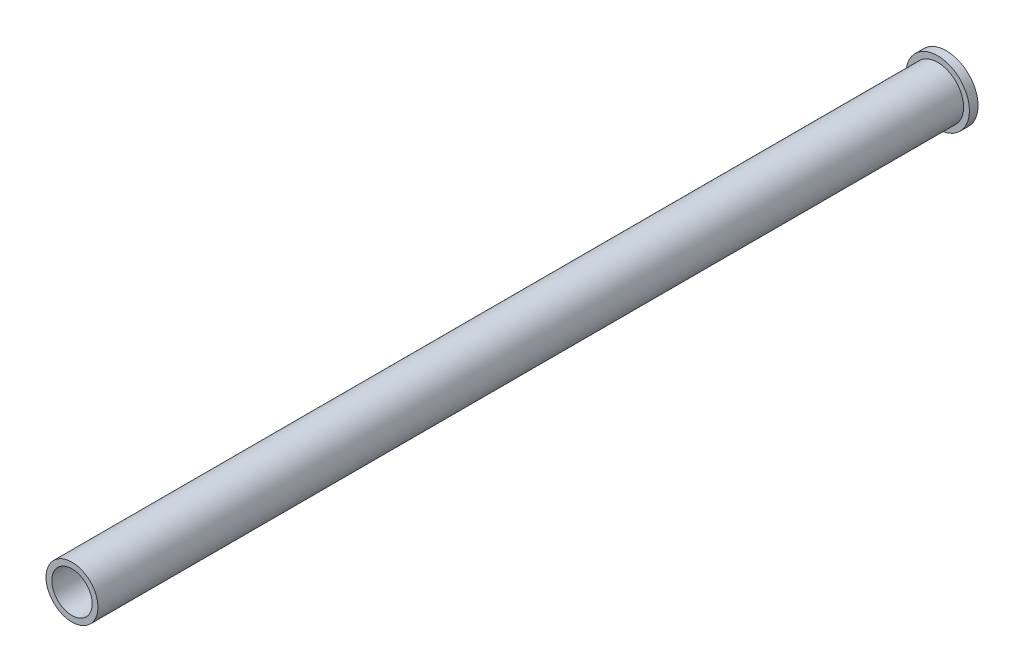
ISO-10303-21;
HEADER;
FILE_DESCRIPTION(('STEP AP214'),'2;1');
FILE_NAME('part.step','',(''),(''),'','','');
FILE_SCHEMA(('AUTOMOTIVE_DESIGN { 1 0 10303 214 1 1 1 1 }'));
ENDSEC;
DATA;
#1=APPLICATION_CONTEXT('core data for automotive mechanical design processes');
#2=APPLICATION_PROTOCOL_DEFINITION('international standard','automotive_design',2000,#1);
#3=PRODUCT_CONTEXT('',#1,'mechanical');
#4=PRODUCT('Part','Part','',(#3));
#5=PRODUCT_RELATED_PRODUCT_CATEGORY('part','',(#4));
#6=PRODUCT_DEFINITION_FORMATION('','',#4);
#7=PRODUCT_DEFINITION_CONTEXT('part definition',#1,'design');
#8=PRODUCT_DEFINITION('design','',#6,#7);
#9=PRODUCT_DEFINITION_SHAPE('','',#8);
#10=(LENGTH_UNIT() NAMED_UNIT(*) SI_UNIT(.MILLI.,.METRE.));
#11=(NAMED_UNIT(*) PLANE_ANGLE_UNIT() SI_UNIT($,.RADIAN.));
#12=(NAMED_UNIT(*) SI_UNIT($,.STERADIAN.) SOLID_ANGLE_UNIT());
#13=UNCERTAINTY_MEASURE_WITH_UNIT(LENGTH_MEASURE(1.E-05),#10,'distance_accuracy_value','');
#14=(GEOMETRIC_REPRESENTATION_CONTEXT(3) GLOBAL_UNCERTAINTY_ASSIGNED_CONTEXT((#13)) GLOBAL_UNIT_ASSIGNED_CONTEXT((#10,
#11,#12)) REPRESENTATION_CONTEXT('',''));
#15=CARTESIAN_POINT('',(0.,0.,0.));
#16=DIRECTION('',(0.,0.,1.));
#17=DIRECTION('',(1.,0.,0.));
#18=AXIS2_PLACEMENT_3D('',#15,#16,#17);
#19=CARTESIAN_POINT('',(-8.45443022772333,1.68372127416524,0.762));
#20=DIRECTION('',(0.,0.,-1.));
#21=DIRECTION('',(-1.,0.,0.));
#22=AXIS2_PLACEMENT_3D('',#19,#20,#21);
#23=CYLINDRICAL_SURFACE('',#22,2.794);
#24=CARTESIAN_POINT('',(-8.45443022772333,1.68372127416524,0.762));
#25=DIRECTION('',(0.,0.,1.));
#26=DIRECTION('',(1.,0.,0.));
#27=AXIS2_PLACEMENT_3D('',#24,#25,#26);
#28=CIRCLE('',#27,2.794);
#29=CARTESIAN_POINT('',(-11.2484302277233,1.68372127416524,0.762));
#30=VERTEX_POINT('',#29);
#31=EDGE_CURVE('E38',#30,#30,#28,.T.);
#32=CARTESIAN_POINT('',(-8.45443022772333,1.68372127416524,0.));
#33=DIRECTION('',(0.,0.,1.));
#34=DIRECTION('',(1.,0.,0.));
#35=AXIS2_PLACEMENT_3D('',#32,#33,#34);
#36=CIRCLE('',#35,2.794);
#37=CARTESIAN_POINT('',(-11.2484302277233,1.68372127416524,0.));
#38=VERTEX_POINT('',#37);
#39=EDGE_CURVE('E34',#38,#38,#36,.T.);
#40=CARTESIAN_POINT('',(-11.2484302277233,1.68372127416524,0.762));
#41=CARTESIAN_POINT('',(-11.2484302277233,1.68372127416524,0.7540625));
#42=CARTESIAN_POINT('',(-11.2484302277233,1.68372127416524,0.746125));
#43=CARTESIAN_POINT('',(-11.2484302277233,1.68372127416524,0.73025));
#44=CARTESIAN_POINT('',(-11.2484302277233,1.68372127416524,0.7223125));
#45=CARTESIAN_POINT('',(-11.2484302277233,1.68372127416524,0.7064375));
#46=CARTESIAN_POINT('',(-11.2484302277233,1.68372127416524,0.6985));
#47=CARTESIAN_POINT('',(-11.2484302277233,1.68372127416524,0.682625));
#48=CARTESIAN_POINT('',(-11.2484302277233,1.68372127416524,0.6746875));
#49=CARTESIAN_POINT('',(-11.2484302277233,1.68372127416524,0.6588125));
#50=CARTESIAN_POINT('',(-11.2484302277233,1.68372127416524,0.650875));
#51=CARTESIAN_POINT('',(-11.2484302277233,1.68372127416524,0.635));
#52=CARTESIAN_POINT('',(-11.2484302277233,1.68372127416524,0.6270625));
#53=CARTESIAN_POINT('',(-11.2484302277233,1.68372127416524,0.6111875));
#54=CARTESIAN_POINT('',(-11.2484302277233,1.68372127416524,0.60325));
#55=CARTESIAN_POINT('',(-11.2484302277233,1.68372127416524,0.587375));
#56=CARTESIAN_POINT('',(-11.2484302277233,1.68372127416524,0.5794375));
#57=CARTESIAN_POINT('',(-11.2484302277233,1.68372127416524,0.5635625));
#58=CARTESIAN_POINT('',(-11.2484302277233,1.68372127416524,0.555625));
#59=CARTESIAN_POINT('',(-11.2484302277233,1.68372127416524,0.53975));
#60=CARTESIAN_POINT('',(-11.2484302277233,1.68372127416524,0.5318125));
#61=CARTESIAN_POINT('',(-11.2484302277233,1.68372127416524,0.5159375));
#62=CARTESIAN_POINT('',(-11.2484302277233,1.68372127416524,0.508));
#63=CARTESIAN_POINT('',(-11.2484302277233,1.68372127416524,0.492125));
#64=CARTESIAN_POINT('',(-11.2484302277233,1.68372127416524,0.4841875));
#65=CARTESIAN_POINT('',(-11.2484302277233,1.68372127416524,0.4683125));
#66=CARTESIAN_POINT('',(-11.2484302277233,1.68372127416524,0.460375));
#67=CARTESIAN_POINT('',(-11.2484302277233,1.68372127416524,0.4445));
#68=CARTESIAN_POINT('',(-11.2484302277233,1.68372127416524,0.4365625));
#69=CARTESIAN_POINT('',(-11.2484302277233,1.68372127416524,0.4206875));
#70=CARTESIAN_POINT('',(-11.2484302277233,1.68372127416524,0.41275));
#71=CARTESIAN_POINT('',(-11.2484302277233,1.68372127416524,0.396875));
#72=CARTESIAN_POINT('',(-11.2484302277233,1.68372127416524,0.3889375));
#73=CARTESIAN_POINT('',(-11.2484302277233,1.68372127416524,0.3730625));
#74=CARTESIAN_POINT('',(-11.2484302277233,1.68372127416524,0.365125));
#75=CARTESIAN_POINT('',(-11.2484302277233,1.68372127416524,0.34925));
#76=CARTESIAN_POINT('',(-11.2484302277233,1.68372127416524,0.3413125));
#77=CARTESIAN_POINT('',(-11.2484302277233,1.68372127416524,0.3254375));
#78=CARTESIAN_POINT('',(-11.2484302277233,1.68372127416524,0.3175));
#79=CARTESIAN_POINT('',(-11.2484302277233,1.68372127416524,0.301625));
#80=CARTESIAN_POINT('',(-11.2484302277233,1.68372127416524,0.2936875));
#81=CARTESIAN_POINT('',(-11.2484302277233,1.68372127416524,0.2778125));
#82=CARTESIAN_POINT('',(-11.2484302277233,1.68372127416524,0.269875));
#83=CARTESIAN_POINT('',(-11.2484302277233,1.68372127416524,0.254));
#84=CARTESIAN_POINT('',(-11.2484302277233,1.68372127416524,0.2460625));
#85=CARTESIAN_POINT('',(-11.2484302277233,1.68372127416524,0.2301875));
#86=CARTESIAN_POINT('',(-11.2484302277233,1.68372127416524,0.22225));
#87=CARTESIAN_POINT('',(-11.2484302277233,1.68372127416524,0.206375));
#88=CARTESIAN_POINT('',(-11.2484302277233,1.68372127416524,0.1984375));
#89=CARTESIAN_POINT('',(-11.2484302277233,1.68372127416524,0.1825625));
#90=CARTESIAN_POINT('',(-11.2484302277233,1.68372127416524,0.174625));
#91=CARTESIAN_POINT('',(-11.2484302277233,1.68372127416524,0.15875));
#92=CARTESIAN_POINT('',(-11.2484302277233,1.68372127416524,0.1508125));
#93=CARTESIAN_POINT('',(-11.2484302277233,1.68372127416524,0.1349375));
#94=CARTESIAN_POINT('',(-11.2484302277233,1.68372127416524,0.127));
#95=CARTESIAN_POINT('',(-11.2484302277233,1.68372127416524,0.111125));
#96=CARTESIAN_POINT('',(-11.2484302277233,1.68372127416524,0.1031875));
#97=CARTESIAN_POINT('',(-11.2484302277233,1.68372127416524,0.0873125));
#98=CARTESIAN_POINT('',(-11.2484302277233,1.68372127416524,0.079375));
#99=CARTESIAN_POINT('',(-11.2484302277233,1.68372127416524,0.0635));
#100=CARTESIAN_POINT('',(-11.2484302277233,1.68372127416524,0.0555625));
#101=CARTESIAN_POINT('',(-11.2484302277233,1.68372127416524,0.0396875));
#102=CARTESIAN_POINT('',(-11.2484302277233,1.68372127416524,0.03175));
#103=CARTESIAN_POINT('',(-11.2484302277233,1.68372127416524,0.015875));
#104=CARTESIAN_POINT('',(-11.2484302277233,1.68372127416524,0.00793749999999999));
#105=CARTESIAN_POINT('',(-11.2484302277233,1.68372127416524,0.));
#106=B_SPLINE_CURVE_WITH_KNOTS('',3,(#40,#41,#42,#43,#44,#45,#46,#47,#48,#49,#50,#51,#52,#53,
#54,#55,#56,#57,#58,#59,#60,#61,#62,#63,#64,#65,#66,#67,#68,#69,#70,#71,#72,#73,#74,#75,#76,#77,
#78,#79,#80,#81,#82,#83,#84,#85,#86,#87,#88,#89,#90,#91,#92,#93,#94,#95,#96,#97,#98,#99,#100,
#101,#102,#103,#104,#105),.UNSPECIFIED.,.F.,.F.,(4,2,2,2,2,2,2,2,2,2,2,2,2,2,2,2,2,2,2,2,2,2,2,
2,2,2,2,2,2,2,2,2,4),(0.,0.0238125,0.0476249999999999,0.0714374999999999,0.09525,0.1190625,
0.142875,0.1666875,0.1905,0.2143125,0.238125,0.2619375,0.28575,0.3095625,0.333375,0.3571875,
0.381,0.4048125,0.428625,0.4524375,0.47625,0.5000625,0.523875,0.5476875,0.5715,0.5953125,
0.619125,0.6429375,0.66675,0.6905625,0.714375,0.7381875,0.762),.UNSPECIFIED.);
#107=EDGE_CURVE('BSEAM31',#30,#38,#106,.T.);
#108=ORIENTED_EDGE('',*,*,#31,.F.);
#109=ORIENTED_EDGE('',*,*,#39,.T.);
#110=ORIENTED_EDGE('',*,*,#107,.T.);
#111=ORIENTED_EDGE('',*,*,#107,.F.);
#112=EDGE_LOOP('',(#108,#110,#109,#111));
#113=FACE_BOUND('',#112,.T.);
#114=ADVANCED_FACE('F31',(#113),#23,.T.);
#115=CARTESIAN_POINT('',(-8.45443022772333,1.68372127416524,0.762));
#116=DIRECTION('',(0.,0.,1.));
#117=DIRECTION('',(1.,0.,0.));
#118=AXIS2_PLACEMENT_3D('',#115,#116,#117);
#119=PLANE('',#118);
#120=CARTESIAN_POINT('',(-8.45443022772333,1.68372127416524,0.762));
#121=DIRECTION('',(0.,0.,1.));
#122=DIRECTION('',(1.,0.,0.));
#123=AXIS2_PLACEMENT_3D('',#120,#121,#122);
#124=CIRCLE('',#123,2.286);
#125=CARTESIAN_POINT('',(-10.7404302277233,1.68372127416524,0.761999999999999));
#126=VERTEX_POINT('',#125);
#127=EDGE_CURVE('E10',#126,#126,#124,.T.);
#128=ORIENTED_EDGE('',*,*,#127,.F.);
#129=EDGE_LOOP('',(#128));
#130=FACE_BOUND('',#129,.T.);
#131=ORIENTED_EDGE('',*,*,#31,.T.);
#132=EDGE_LOOP('',(#131));
#133=FACE_BOUND('',#132,.T.);
#134=ADVANCED_FACE('F75',(#130,#133),#119,.T.);
#135=CARTESIAN_POINT('',(-8.45443022772333,1.68372127416524,0.));
#136=DIRECTION('',(0.,0.,1.));
#137=DIRECTION('',(1.,0.,0.));
#138=AXIS2_PLACEMENT_3D('',#135,#136,#137);
#139=PLANE('',#138);
#140=ORIENTED_EDGE('',*,*,#39,.F.);
#141=EDGE_LOOP('',(#140));
#142=FACE_BOUND('',#141,.T.);
#143=ADVANCED_FACE('F70',(#142),#139,.F.);
#144=CARTESIAN_POINT('',(-8.45443022772333,1.68372127416524,76.962));
#145=DIRECTION('',(0.,0.,-1.));
#146=DIRECTION('',(-1.,0.,0.));
#147=AXIS2_PLACEMENT_3D('',#144,#145,#146);
#148=CYLINDRICAL_SURFACE('',#147,2.286);
#149=CARTESIAN_POINT('',(-8.45443022772333,1.68372127416524,76.962));
#150=DIRECTION('',(0.,0.,1.));
#151=DIRECTION('',(1.,0.,0.));
#152=AXIS2_PLACEMENT_3D('',#149,#150,#151);
#153=CIRCLE('',#152,2.286);
#154=CARTESIAN_POINT('',(-10.7404302277233,1.68372127416524,76.962));
#155=VERTEX_POINT('',#154);
#156=EDGE_CURVE('E44',#155,#155,#153,.T.);
#157=CARTESIAN_POINT('',(-10.7404302277233,1.68372127416524,76.962));
#158=CARTESIAN_POINT('',(-10.7404302277233,1.68372127416524,76.16825));
#159=CARTESIAN_POINT('',(-10.7404302277233,1.68372127416524,75.3745));
#160=CARTESIAN_POINT('',(-10.7404302277233,1.68372127416524,73.787));
#161=CARTESIAN_POINT('',(-10.7404302277233,1.68372127416524,72.99325));
#162=CARTESIAN_POINT('',(-10.7404302277233,1.68372127416524,71.40575));
#163=CARTESIAN_POINT('',(-10.7404302277233,1.68372127416524,70.612));
#164=CARTESIAN_POINT('',(-10.7404302277233,1.68372127416524,69.0245));
#165=CARTESIAN_POINT('',(-10.7404302277233,1.68372127416524,68.23075));
#166=CARTESIAN_POINT('',(-10.7404302277233,1.68372127416524,66.64325));
#167=CARTESIAN_POINT('',(-10.7404302277233,1.68372127416524,65.8495));
#168=CARTESIAN_POINT('',(-10.7404302277233,1.68372127416524,64.262));
#169=CARTESIAN_POINT('',(-10.7404302277233,1.68372127416524,63.46825));
#170=CARTESIAN_POINT('',(-10.7404302277233,1.68372127416524,61.88075));
#171=CARTESIAN_POINT('',(-10.7404302277233,1.68372127416524,61.087));
#172=CARTESIAN_POINT('',(-10.7404302277233,1.68372127416524,59.4995));
#173=CARTESIAN_POINT('',(-10.7404302277233,1.68372127416524,58.70575));
#174=CARTESIAN_POINT('',(-10.7404302277233,1.68372127416524,57.11825));
#175=CARTESIAN_POINT('',(-10.7404302277233,1.68372127416524,56.3245));
#176=CARTESIAN_POINT('',(-10.7404302277233,1.68372127416524,54.737));
#177=CARTESIAN_POINT('',(-10.7404302277233,1.68372127416524,53.94325));
#178=CARTESIAN_POINT('',(-10.7404302277233,1.68372127416524,52.35575));
#179=CARTESIAN_POINT('',(-10.7404302277233,1.68372127416524,51.562));
#180=CARTESIAN_POINT('',(-10.7404302277233,1.68372127416524,49.9745));
#181=CARTESIAN_POINT('',(-10.7404302277233,1.68372127416524,49.18075));
#182=CARTESIAN_POINT('',(-10.7404302277233,1.68372127416524,47.59325));
#183=CARTESIAN_POINT('',(-10.7404302277233,1.68372127416524,46.7995));
#184=CARTESIAN_POINT('',(-10.7404302277233,1.68372127416524,45.212));
#185=CARTESIAN_POINT('',(-10.7404302277233,1.68372127416524,44.41825));
#186=CARTESIAN_POINT('',(-10.7404302277233,1.68372127416524,42.83075));
#187=CARTESIAN_POINT('',(-10.7404302277233,1.68372127416524,42.037));
#188=CARTESIAN_POINT('',(-10.7404302277233,1.68372127416524,40.4495));
#189=CARTESIAN_POINT('',(-10.7404302277233,1.68372127416524,39.65575));
#190=CARTESIAN_POINT('',(-10.7404302277233,1.68372127416524,38.06825));
#191=CARTESIAN_POINT('',(-10.7404302277233,1.68372127416524,37.2745));
#192=CARTESIAN_POINT('',(-10.7404302277233,1.68372127416524,35.687));
#193=CARTESIAN_POINT('',(-10.7404302277233,1.68372127416524,34.89325));
#194=CARTESIAN_POINT('',(-10.7404302277233,1.68372127416524,33.30575));
#195=CARTESIAN_POINT('',(-10.7404302277233,1.68372127416524,32.512));
#196=CARTESIAN_POINT('',(-10.7404302277233,1.68372127416524,30.9245));
#197=CARTESIAN_POINT('',(-10.7404302277233,1.68372127416524,30.13075));
#198=CARTESIAN_POINT('',(-10.7404302277233,1.68372127416524,28.54325));
#199=CARTESIAN_POINT('',(-10.7404302277233,1.68372127416524,27.7495));
#200=CARTESIAN_POINT('',(-10.7404302277233,1.68372127416524,26.162));
#201=CARTESIAN_POINT('',(-10.7404302277233,1.68372127416524,25.36825));
#202=CARTESIAN_POINT('',(-10.7404302277233,1.68372127416524,23.78075));
#203=CARTESIAN_POINT('',(-10.7404302277233,1.68372127416524,22.987));
#204=CARTESIAN_POINT('',(-10.7404302277233,1.68372127416524,21.3995));
#205=CARTESIAN_POINT('',(-10.7404302277233,1.68372127416524,20.60575));
#206=CARTESIAN_POINT('',(-10.7404302277233,1.68372127416524,19.01825));
#207=CARTESIAN_POINT('',(-10.7404302277233,1.68372127416524,18.2245));
#208=CARTESIAN_POINT('',(-10.7404302277233,1.68372127416524,16.637));
#209=CARTESIAN_POINT('',(-10.7404302277233,1.68372127416524,15.84325));
#210=CARTESIAN_POINT('',(-10.7404302277233,1.68372127416524,14.25575));
#211=CARTESIAN_POINT('',(-10.7404302277233,1.68372127416524,13.462));
#212=CARTESIAN_POINT('',(-10.7404302277233,1.68372127416524,11.8745));
#213=CARTESIAN_POINT('',(-10.7404302277233,1.68372127416524,11.08075));
#214=CARTESIAN_POINT('',(-10.7404302277233,1.68372127416524,9.49325));
#215=CARTESIAN_POINT('',(-10.7404302277233,1.68372127416524,8.6995));
#216=CARTESIAN_POINT('',(-10.7404302277233,1.68372127416524,7.112));
#217=CARTESIAN_POINT('',(-10.7404302277233,1.68372127416524,6.31825));
#218=CARTESIAN_POINT('',(-10.7404302277233,1.68372127416524,4.73075));
#219=CARTESIAN_POINT('',(-10.7404302277233,1.68372127416524,3.937));
#220=CARTESIAN_POINT('',(-10.7404302277233,1.68372127416524,2.3495));
#221=CARTESIAN_POINT('',(-10.7404302277233,1.68372127416524,1.55575));
#222=CARTESIAN_POINT('',(-10.7404302277233,1.68372127416524,0.761999999999999));
#223=B_SPLINE_CURVE_WITH_KNOTS('',3,(#157,#158,#159,#160,#161,#162,#163,#164,#165,#166,#167,
#168,#169,#170,#171,#172,#173,#174,#175,#176,#177,#178,#179,#180,#181,#182,#183,#184,#185,#186,
#187,#188,#189,#190,#191,#192,#193,#194,#195,#196,#197,#198,#199,#200,#201,#202,#203,#204,#205,
#206,#207,#208,#209,#210,#211,#212,#213,#214,#215,#216,#217,#218,#219,#220,#221,#222),
.UNSPECIFIED.,.F.,.F.,(4,2,2,2,2,2,2,2,2,2,2,2,2,2,2,2,2,2,2,2,2,2,2,2,2,2,2,2,2,2,2,2,4),(0.,
2.38124999999999,4.76249999999999,7.14374999999999,9.52499999999999,11.90625,14.2875,16.66875,
19.05,21.43125,23.8125,26.19375,28.575,30.95625,33.3375,35.71875,38.1,40.48125,42.8625,45.24375,
47.625,50.00625,52.3875,54.76875,57.15,59.53125,61.9125,64.29375,66.675,69.05625,71.4375,
73.81875,76.2),.UNSPECIFIED.);
#224=EDGE_CURVE('BSEAM65',#155,#126,#223,.T.);
#225=ORIENTED_EDGE('',*,*,#156,.F.);
#226=ORIENTED_EDGE('',*,*,#127,.T.);
#227=ORIENTED_EDGE('',*,*,#224,.T.);
#228=ORIENTED_EDGE('',*,*,#224,.F.);
#229=EDGE_LOOP('',(#225,#227,#226,#228));
#230=FACE_BOUND('',#229,.T.);
#231=ADVANCED_FACE('F65',(#230),#148,.T.);
#232=CARTESIAN_POINT('',(-8.45443022772333,1.68372127416524,76.962));
#233=DIRECTION('',(0.,0.,1.));
#234=DIRECTION('',(1.,0.,0.));
#235=AXIS2_PLACEMENT_3D('',#232,#233,#234);
#236=PLANE('',#235);
#237=CARTESIAN_POINT('',(-8.45443022772333,1.68372127416524,76.962));
#238=DIRECTION('',(0.,0.,1.));
#239=DIRECTION('',(1.,0.,0.));
#240=AXIS2_PLACEMENT_3D('',#237,#238,#239);
#241=CIRCLE('',#240,1.778);
#242=CARTESIAN_POINT('',(-6.67643022772333,1.68372127416524,76.962));
#243=VERTEX_POINT('',#242);
#244=EDGE_CURVE('E48',#243,#243,#241,.T.);
#245=ORIENTED_EDGE('',*,*,#244,.F.);
#246=EDGE_LOOP('',(#245));
#247=FACE_BOUND('',#246,.T.);
#248=ORIENTED_EDGE('',*,*,#156,.T.);
#249=EDGE_LOOP('',(#248));
#250=FACE_BOUND('',#249,.T.);
#251=ADVANCED_FACE('F59',(#247,#250),#236,.T.);
#252=CARTESIAN_POINT('',(-8.45443022772333,1.68372127416524,64.262));
#253=DIRECTION('',(0.,0.,1.));
#254=DIRECTION('',(1.,0.,0.));
#255=AXIS2_PLACEMENT_3D('',#252,#253,#254);
#256=CYLINDRICAL_SURFACE('',#255,1.778);
#257=CARTESIAN_POINT('',(-8.45443022772333,1.68372127416524,64.262));
#258=DIRECTION('',(0.,0.,1.));
#259=DIRECTION('',(1.,0.,0.));
#260=AXIS2_PLACEMENT_3D('',#257,#258,#259);
#261=CIRCLE('',#260,1.778);
#262=CARTESIAN_POINT('',(-6.67643022772333,1.68372127416524,64.262));
#263=VERTEX_POINT('',#262);
#264=EDGE_CURVE('E47',#263,#263,#261,.T.);
#265=ORIENTED_EDGE('',*,*,#264,.F.);
#266=EDGE_LOOP('',(#265));
#267=FACE_BOUND('',#266,.T.);
#268=ORIENTED_EDGE('',*,*,#244,.T.);
#269=EDGE_LOOP('',(#268));
#270=FACE_BOUND('',#269,.T.);
#271=ADVANCED_FACE('F56',(#267,#270),#256,.F.);
#272=CARTESIAN_POINT('',(-8.45443022772333,1.68372127416524,64.262));
#273=DIRECTION('',(0.,0.,1.));
#274=DIRECTION('',(1.,0.,0.));
#275=AXIS2_PLACEMENT_3D('',#272,#273,#274);
#276=PLANE('',#275);
#277=ORIENTED_EDGE('',*,*,#264,.T.);
#278=EDGE_LOOP('',(#277));
#279=FACE_BOUND('',#278,.T.);
#280=ADVANCED_FACE('F54',(#279),#276,.T.);
#281=CLOSED_SHELL('',(#114,#134,#143,#231,#251,#271,#280));
#282=MANIFOLD_SOLID_BREP('B2',#281);
#283=ADVANCED_BREP_SHAPE_REPRESENTATION('',(#18,#282),#14);
#284=SHAPE_DEFINITION_REPRESENTATION(#9,#283);
ENDSEC;
END-ISO-10303-21;
